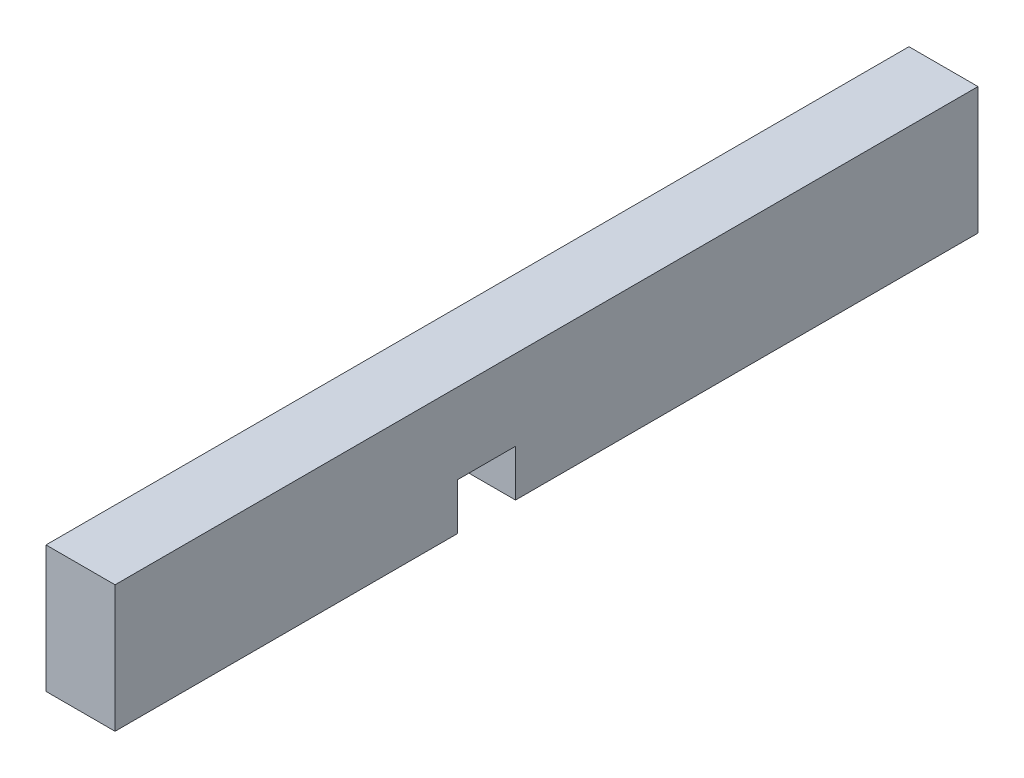
ISO-10303-21;
HEADER;
FILE_DESCRIPTION(('STEP AP214'),'2;1');
FILE_NAME('part.step','',(''),(''),'','','');
FILE_SCHEMA(('AUTOMOTIVE_DESIGN { 1 0 10303 214 1 1 1 1 }'));
ENDSEC;
DATA;
#1=APPLICATION_CONTEXT('core data for automotive mechanical design processes');
#2=APPLICATION_PROTOCOL_DEFINITION('international standard','automotive_design',2000,#1);
#3=PRODUCT_CONTEXT('',#1,'mechanical');
#4=PRODUCT('Part','Part','',(#3));
#5=PRODUCT_RELATED_PRODUCT_CATEGORY('part','',(#4));
#6=PRODUCT_DEFINITION_FORMATION('','',#4);
#7=PRODUCT_DEFINITION_CONTEXT('part definition',#1,'design');
#8=PRODUCT_DEFINITION('design','',#6,#7);
#9=PRODUCT_DEFINITION_SHAPE('','',#8);
#10=(LENGTH_UNIT() NAMED_UNIT(*) SI_UNIT(.MILLI.,.METRE.));
#11=(NAMED_UNIT(*) PLANE_ANGLE_UNIT() SI_UNIT($,.RADIAN.));
#12=(NAMED_UNIT(*) SI_UNIT($,.STERADIAN.) SOLID_ANGLE_UNIT());
#13=UNCERTAINTY_MEASURE_WITH_UNIT(LENGTH_MEASURE(1.E-05),#10,'distance_accuracy_value','');
#14=(GEOMETRIC_REPRESENTATION_CONTEXT(3) GLOBAL_UNCERTAINTY_ASSIGNED_CONTEXT((#13)) GLOBAL_UNIT_ASSIGNED_CONTEXT((#10,
#11,#12)) REPRESENTATION_CONTEXT('',''));
#15=CARTESIAN_POINT('',(0.,0.,0.));
#16=DIRECTION('',(0.,0.,1.));
#17=DIRECTION('',(1.,0.,0.));
#18=AXIS2_PLACEMENT_3D('',#15,#16,#17);
#19=CARTESIAN_POINT('',(2.3495,-4.318,29.3624));
#20=DIRECTION('',(0.,1.,0.));
#21=DIRECTION('',(0.,0.,1.));
#22=AXIS2_PLACEMENT_3D('',#19,#20,#21);
#23=PLANE('',#22);
#24=DIRECTION('',(0.,0.,-1.));
#25=VECTOR('',#24,1.);
#26=CARTESIAN_POINT('',(2.3495,-4.318,29.3624));
#27=LINE('',#26,#25);
#28=CARTESIAN_POINT('',(2.3495,-4.318,2.10857303391812));
#29=VERTEX_POINT('',#28);
#30=CARTESIAN_POINT('',(2.3495,-4.318,-29.3624));
#31=VERTEX_POINT('',#30);
#32=EDGE_CURVE('E58',#29,#31,#27,.T.);
#33=ORIENTED_EDGE('',*,*,#32,.F.);
#34=DIRECTION('',(1.,0.,0.));
#35=VECTOR('',#34,1.);
#36=CARTESIAN_POINT('',(-7.42702289605867,-4.318,2.10857303391812));
#37=LINE('',#36,#35);
#38=CARTESIAN_POINT('',(-2.3495,-4.318,2.10857303391812));
#39=VERTEX_POINT('',#38);
#40=EDGE_CURVE('E112',#39,#29,#37,.T.);
#41=ORIENTED_EDGE('',*,*,#40,.F.);
#42=DIRECTION('',(0.,0.,-1.));
#43=VECTOR('',#42,1.);
#44=CARTESIAN_POINT('',(-2.3495,-4.318,29.3624));
#45=LINE('',#44,#43);
#46=CARTESIAN_POINT('',(-2.3495,-4.318,-29.3624));
#47=VERTEX_POINT('',#46);
#48=EDGE_CURVE('E80',#39,#47,#45,.T.);
#49=ORIENTED_EDGE('',*,*,#48,.T.);
#50=DIRECTION('',(-1.,0.,0.));
#51=VECTOR('',#50,1.);
#52=CARTESIAN_POINT('',(2.3495,-4.318,-29.3624));
#53=LINE('',#52,#51);
#54=EDGE_CURVE('E132',#31,#47,#53,.T.);
#55=ORIENTED_EDGE('',*,*,#54,.F.);
#56=EDGE_LOOP('',(#33,#41,#49,#55));
#57=FACE_BOUND('',#56,.T.);
#58=ADVANCED_FACE('F34',(#57),#23,.F.);
#59=CARTESIAN_POINT('',(2.3495,-4.318,-29.3624));
#60=DIRECTION('',(0.,0.,1.));
#61=DIRECTION('',(1.,0.,0.));
#62=AXIS2_PLACEMENT_3D('',#59,#60,#61);
#63=PLANE('',#62);
#64=DIRECTION('',(0.,1.,0.));
#65=VECTOR('',#64,1.);
#66=CARTESIAN_POINT('',(-2.3495,-4.318,-29.3624));
#67=LINE('',#66,#65);
#68=CARTESIAN_POINT('',(-2.3495,4.318,-29.3624));
#69=VERTEX_POINT('',#68);
#70=EDGE_CURVE('E122',#47,#69,#67,.T.);
#71=ORIENTED_EDGE('',*,*,#70,.T.);
#72=DIRECTION('',(-1.,0.,0.));
#73=VECTOR('',#72,1.);
#74=CARTESIAN_POINT('',(2.3495,4.318,-29.3624));
#75=LINE('',#74,#73);
#76=CARTESIAN_POINT('',(2.3495,4.318,-29.3624));
#77=VERTEX_POINT('',#76);
#78=EDGE_CURVE('E11',#77,#69,#75,.T.);
#79=ORIENTED_EDGE('',*,*,#78,.F.);
#80=DIRECTION('',(0.,1.,0.));
#81=VECTOR('',#80,1.);
#82=CARTESIAN_POINT('',(2.3495,-4.318,-29.3624));
#83=LINE('',#82,#81);
#84=EDGE_CURVE('E127',#31,#77,#83,.T.);
#85=ORIENTED_EDGE('',*,*,#84,.F.);
#86=ORIENTED_EDGE('',*,*,#54,.T.);
#87=EDGE_LOOP('',(#71,#79,#85,#86));
#88=FACE_BOUND('',#87,.T.);
#89=ADVANCED_FACE('F36',(#88),#63,.F.);
#90=CARTESIAN_POINT('',(2.3495,4.318,29.3624));
#91=DIRECTION('',(0.,-1.,0.));
#92=DIRECTION('',(0.,0.,-1.));
#93=AXIS2_PLACEMENT_3D('',#90,#91,#92);
#94=PLANE('',#93);
#95=DIRECTION('',(0.,0.,1.));
#96=VECTOR('',#95,1.);
#97=CARTESIAN_POINT('',(-2.3495,4.318,29.3624));
#98=LINE('',#97,#96);
#99=CARTESIAN_POINT('',(-2.3495,4.318,29.3624));
#100=VERTEX_POINT('',#99);
#101=EDGE_CURVE('E128',#69,#100,#98,.T.);
#102=ORIENTED_EDGE('',*,*,#101,.T.);
#103=DIRECTION('',(-1.,0.,0.));
#104=VECTOR('',#103,1.);
#105=CARTESIAN_POINT('',(2.3495,4.318,29.3624));
#106=LINE('',#105,#104);
#107=CARTESIAN_POINT('',(2.3495,4.318,29.3624));
#108=VERTEX_POINT('',#107);
#109=EDGE_CURVE('E42',#108,#100,#106,.T.);
#110=ORIENTED_EDGE('',*,*,#109,.F.);
#111=DIRECTION('',(0.,0.,1.));
#112=VECTOR('',#111,1.);
#113=CARTESIAN_POINT('',(2.3495,4.318,29.3624));
#114=LINE('',#113,#112);
#115=EDGE_CURVE('E87',#77,#108,#114,.T.);
#116=ORIENTED_EDGE('',*,*,#115,.F.);
#117=ORIENTED_EDGE('',*,*,#78,.T.);
#118=EDGE_LOOP('',(#102,#110,#116,#117));
#119=FACE_BOUND('',#118,.T.);
#120=ADVANCED_FACE('F155',(#119),#94,.F.);
#121=CARTESIAN_POINT('',(2.3495,-4.318,29.3624));
#122=DIRECTION('',(0.,0.,-1.));
#123=DIRECTION('',(-1.,0.,0.));
#124=AXIS2_PLACEMENT_3D('',#121,#122,#123);
#125=PLANE('',#124);
#126=DIRECTION('',(0.,-1.,0.));
#127=VECTOR('',#126,1.);
#128=CARTESIAN_POINT('',(-2.3495,-4.318,29.3624));
#129=LINE('',#128,#127);
#130=CARTESIAN_POINT('',(-2.3495,-4.318,29.3624));
#131=VERTEX_POINT('',#130);
#132=EDGE_CURVE('E124',#100,#131,#129,.T.);
#133=ORIENTED_EDGE('',*,*,#132,.T.);
#134=DIRECTION('',(-1.,0.,0.));
#135=VECTOR('',#134,1.);
#136=CARTESIAN_POINT('',(2.3495,-4.318,29.3624));
#137=LINE('',#136,#135);
#138=CARTESIAN_POINT('',(2.3495,-4.318,29.3624));
#139=VERTEX_POINT('',#138);
#140=EDGE_CURVE('E134',#139,#131,#137,.T.);
#141=ORIENTED_EDGE('',*,*,#140,.F.);
#142=DIRECTION('',(0.,-1.,0.));
#143=VECTOR('',#142,1.);
#144=CARTESIAN_POINT('',(2.3495,-4.318,29.3624));
#145=LINE('',#144,#143);
#146=EDGE_CURVE('E143',#108,#139,#145,.T.);
#147=ORIENTED_EDGE('',*,*,#146,.F.);
#148=ORIENTED_EDGE('',*,*,#109,.T.);
#149=EDGE_LOOP('',(#133,#141,#147,#148));
#150=FACE_BOUND('',#149,.T.);
#151=ADVANCED_FACE('F141',(#150),#125,.F.);
#152=CARTESIAN_POINT('',(-2.3495,-4.318,6.07097303391812));
#153=VERTEX_POINT('',#152);
#154=EDGE_CURVE('E123',#131,#153,#45,.T.);
#155=ORIENTED_EDGE('',*,*,#154,.T.);
#156=DIRECTION('',(1.,0.,0.));
#157=VECTOR('',#156,1.);
#158=CARTESIAN_POINT('',(-7.42702289605867,-4.318,6.07097303391812));
#159=LINE('',#158,#157);
#160=CARTESIAN_POINT('',(2.3495,-4.318,6.07097303391812));
#161=VERTEX_POINT('',#160);
#162=EDGE_CURVE('E49',#153,#161,#159,.T.);
#163=ORIENTED_EDGE('',*,*,#162,.T.);
#164=EDGE_CURVE('E135',#139,#161,#27,.T.);
#165=ORIENTED_EDGE('',*,*,#164,.F.);
#166=ORIENTED_EDGE('',*,*,#140,.T.);
#167=EDGE_LOOP('',(#155,#163,#165,#166));
#168=FACE_BOUND('',#167,.T.);
#169=ADVANCED_FACE('F147',(#168),#23,.F.);
#170=CARTESIAN_POINT('',(2.3495,0.,0.));
#171=DIRECTION('',(-1.,0.,0.));
#172=DIRECTION('',(0.,0.,1.));
#173=AXIS2_PLACEMENT_3D('',#170,#171,#172);
#174=PLANE('',#173);
#175=DIRECTION('',(0.,0.,1.));
#176=VECTOR('',#175,1.);
#177=CARTESIAN_POINT('',(2.3495,-1.143,6.07097303391812));
#178=LINE('',#177,#176);
#179=CARTESIAN_POINT('',(2.3495,-1.143,2.10857303391812));
#180=VERTEX_POINT('',#179);
#181=CARTESIAN_POINT('',(2.3495,-1.143,6.07097303391812));
#182=VERTEX_POINT('',#181);
#183=EDGE_CURVE('E117',#180,#182,#178,.T.);
#184=ORIENTED_EDGE('',*,*,#183,.F.);
#185=DIRECTION('',(0.,1.,0.));
#186=VECTOR('',#185,1.);
#187=CARTESIAN_POINT('',(2.3495,-4.318,2.10857303391812));
#188=LINE('',#187,#186);
#189=EDGE_CURVE('E170',#29,#180,#188,.T.);
#190=ORIENTED_EDGE('',*,*,#189,.F.);
#191=ORIENTED_EDGE('',*,*,#32,.T.);
#192=ORIENTED_EDGE('',*,*,#84,.T.);
#193=ORIENTED_EDGE('',*,*,#115,.T.);
#194=ORIENTED_EDGE('',*,*,#146,.T.);
#195=ORIENTED_EDGE('',*,*,#164,.T.);
#196=DIRECTION('',(0.,-1.,0.));
#197=VECTOR('',#196,1.);
#198=CARTESIAN_POINT('',(2.3495,-4.318,6.07097303391812));
#199=LINE('',#198,#197);
#200=EDGE_CURVE('E168',#182,#161,#199,.T.);
#201=ORIENTED_EDGE('',*,*,#200,.F.);
#202=EDGE_LOOP('',(#184,#190,#191,#192,#193,#194,#195,#201));
#203=FACE_BOUND('',#202,.T.);
#204=ADVANCED_FACE('F177',(#203),#174,.F.);
#205=CARTESIAN_POINT('',(-2.3495,0.,0.));
#206=DIRECTION('',(-1.,0.,0.));
#207=DIRECTION('',(0.,0.,1.));
#208=AXIS2_PLACEMENT_3D('',#205,#206,#207);
#209=PLANE('',#208);
#210=DIRECTION('',(0.,1.,0.));
#211=VECTOR('',#210,1.);
#212=CARTESIAN_POINT('',(-2.3495,-4.318,2.10857303391812));
#213=LINE('',#212,#211);
#214=CARTESIAN_POINT('',(-2.3495,-1.143,2.10857303391812));
#215=VERTEX_POINT('',#214);
#216=EDGE_CURVE('E109',#39,#215,#213,.T.);
#217=ORIENTED_EDGE('',*,*,#216,.T.);
#218=DIRECTION('',(0.,0.,1.));
#219=VECTOR('',#218,1.);
#220=CARTESIAN_POINT('',(-2.3495,-1.143,6.07097303391812));
#221=LINE('',#220,#219);
#222=CARTESIAN_POINT('',(-2.3495,-1.143,6.07097303391812));
#223=VERTEX_POINT('',#222);
#224=EDGE_CURVE('E163',#215,#223,#221,.T.);
#225=ORIENTED_EDGE('',*,*,#224,.T.);
#226=DIRECTION('',(0.,-1.,0.));
#227=VECTOR('',#226,1.);
#228=CARTESIAN_POINT('',(-2.3495,-4.318,6.07097303391812));
#229=LINE('',#228,#227);
#230=EDGE_CURVE('E145',#223,#153,#229,.T.);
#231=ORIENTED_EDGE('',*,*,#230,.T.);
#232=ORIENTED_EDGE('',*,*,#154,.F.);
#233=ORIENTED_EDGE('',*,*,#132,.F.);
#234=ORIENTED_EDGE('',*,*,#101,.F.);
#235=ORIENTED_EDGE('',*,*,#70,.F.);
#236=ORIENTED_EDGE('',*,*,#48,.F.);
#237=EDGE_LOOP('',(#217,#225,#231,#232,#233,#234,#235,#236));
#238=FACE_BOUND('',#237,.T.);
#239=ADVANCED_FACE('F120',(#238),#209,.T.);
#240=CARTESIAN_POINT('',(-7.42702289605867,-4.318,2.10857303391812));
#241=DIRECTION('',(0.,0.,-1.));
#242=DIRECTION('',(-1.,0.,0.));
#243=AXIS2_PLACEMENT_3D('',#240,#241,#242);
#244=PLANE('',#243);
#245=ORIENTED_EDGE('',*,*,#40,.T.);
#246=ORIENTED_EDGE('',*,*,#189,.T.);
#247=DIRECTION('',(1.,0.,0.));
#248=VECTOR('',#247,1.);
#249=CARTESIAN_POINT('',(-7.42702289605867,-1.143,2.10857303391812));
#250=LINE('',#249,#248);
#251=EDGE_CURVE('E113',#215,#180,#250,.T.);
#252=ORIENTED_EDGE('',*,*,#251,.F.);
#253=ORIENTED_EDGE('',*,*,#216,.F.);
#254=EDGE_LOOP('',(#245,#246,#252,#253));
#255=FACE_BOUND('',#254,.T.);
#256=ADVANCED_FACE('F110',(#255),#244,.F.);
#257=CARTESIAN_POINT('',(-7.42702289605867,-1.143,6.07097303391812));
#258=DIRECTION('',(0.,1.,0.));
#259=DIRECTION('',(0.,0.,1.));
#260=AXIS2_PLACEMENT_3D('',#257,#258,#259);
#261=PLANE('',#260);
#262=ORIENTED_EDGE('',*,*,#251,.T.);
#263=ORIENTED_EDGE('',*,*,#183,.T.);
#264=DIRECTION('',(1.,0.,0.));
#265=VECTOR('',#264,1.);
#266=CARTESIAN_POINT('',(-7.42702289605867,-1.143,6.07097303391812));
#267=LINE('',#266,#265);
#268=EDGE_CURVE('E164',#223,#182,#267,.T.);
#269=ORIENTED_EDGE('',*,*,#268,.F.);
#270=ORIENTED_EDGE('',*,*,#224,.F.);
#271=EDGE_LOOP('',(#262,#263,#269,#270));
#272=FACE_BOUND('',#271,.T.);
#273=ADVANCED_FACE('F176',(#272),#261,.F.);
#274=CARTESIAN_POINT('',(-7.42702289605867,-4.318,6.07097303391812));
#275=DIRECTION('',(0.,0.,1.));
#276=DIRECTION('',(1.,0.,0.));
#277=AXIS2_PLACEMENT_3D('',#274,#275,#276);
#278=PLANE('',#277);
#279=ORIENTED_EDGE('',*,*,#268,.T.);
#280=ORIENTED_EDGE('',*,*,#200,.T.);
#281=ORIENTED_EDGE('',*,*,#162,.F.);
#282=ORIENTED_EDGE('',*,*,#230,.F.);
#283=EDGE_LOOP('',(#279,#280,#281,#282));
#284=FACE_BOUND('',#283,.T.);
#285=ADVANCED_FACE('F178',(#284),#278,.F.);
#286=CLOSED_SHELL('',(#58,#89,#120,#151,#169,#204,#239,#256,#273,#285));
#287=MANIFOLD_SOLID_BREP('B2',#286);
#288=ADVANCED_BREP_SHAPE_REPRESENTATION('',(#18,#287),#14);
#289=SHAPE_DEFINITION_REPRESENTATION(#9,#288);
ENDSEC;
END-ISO-10303-21;
